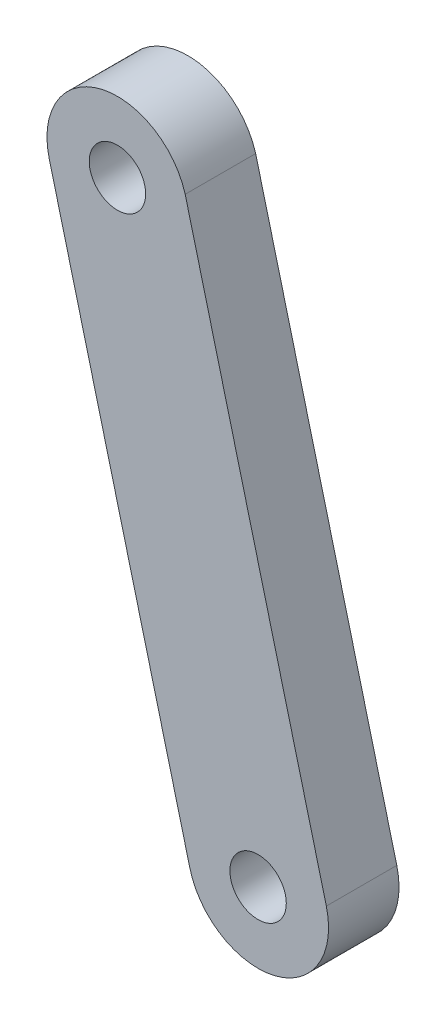
ISO-10303-21;
HEADER;
FILE_DESCRIPTION(('STEP AP214'),'2;1');
FILE_NAME('part.step','',(''),(''),'','','');
FILE_SCHEMA(('AUTOMOTIVE_DESIGN { 1 0 10303 214 1 1 1 1 }'));
ENDSEC;
DATA;
#1=APPLICATION_CONTEXT('core data for automotive mechanical design processes');
#2=APPLICATION_PROTOCOL_DEFINITION('international standard','automotive_design',2000,#1);
#3=PRODUCT_CONTEXT('',#1,'mechanical');
#4=PRODUCT('Part','Part','',(#3));
#5=PRODUCT_RELATED_PRODUCT_CATEGORY('part','',(#4));
#6=PRODUCT_DEFINITION_FORMATION('','',#4);
#7=PRODUCT_DEFINITION_CONTEXT('part definition',#1,'design');
#8=PRODUCT_DEFINITION('design','',#6,#7);
#9=PRODUCT_DEFINITION_SHAPE('','',#8);
#10=(LENGTH_UNIT() NAMED_UNIT(*) SI_UNIT(.MILLI.,.METRE.));
#11=(NAMED_UNIT(*) PLANE_ANGLE_UNIT() SI_UNIT($,.RADIAN.));
#12=(NAMED_UNIT(*) SI_UNIT($,.STERADIAN.) SOLID_ANGLE_UNIT());
#13=UNCERTAINTY_MEASURE_WITH_UNIT(LENGTH_MEASURE(1.E-05),#10,'distance_accuracy_value','');
#14=(GEOMETRIC_REPRESENTATION_CONTEXT(3) GLOBAL_UNCERTAINTY_ASSIGNED_CONTEXT((#13)) GLOBAL_UNIT_ASSIGNED_CONTEXT((#10,
#11,#12)) REPRESENTATION_CONTEXT('',''));
#15=CARTESIAN_POINT('',(0.,0.,0.));
#16=DIRECTION('',(0.,0.,1.));
#17=DIRECTION('',(1.,0.,0.));
#18=AXIS2_PLACEMENT_3D('',#15,#16,#17);
#19=CARTESIAN_POINT('',(-53.228737493068,-13.7629727954204,2.5));
#20=DIRECTION('',(0.968160490142826,0.25033031244019,0.));
#21=DIRECTION('',(-0.25033031244019,0.968160490142826,0.));
#22=AXIS2_PLACEMENT_3D('',#19,#20,#21);
#23=PLANE('',#22);
#24=DIRECTION('',(0.25033031244019,-0.968160490142826,0.));
#25=VECTOR('',#24,1.);
#26=CARTESIAN_POINT('',(-53.228737493068,-13.7629727954204,0.));
#27=LINE('',#26,#25);
#28=CARTESIAN_POINT('',(-34.5729834558803,-85.9146982359543,0.));
#29=VERTEX_POINT('',#28);
#30=CARTESIAN_POINT('',(-29.5834465668799,-105.21189174381,0.));
#31=VERTEX_POINT('',#30);
#32=EDGE_CURVE('E109',#29,#31,#27,.T.);
#33=ORIENTED_EDGE('',*,*,#32,.T.);
#34=DIRECTION('',(0.,0.,-1.));
#35=VECTOR('',#34,1.);
#36=CARTESIAN_POINT('',(-29.5834465668799,-105.21189174381,2.5));
#37=LINE('',#36,#35);
#38=CARTESIAN_POINT('',(-29.5834465668799,-105.21189174381,2.5));
#39=VERTEX_POINT('',#38);
#40=EDGE_CURVE('E11',#39,#31,#37,.T.);
#41=ORIENTED_EDGE('',*,*,#40,.F.);
#42=DIRECTION('',(0.25033031244019,-0.968160490142826,0.));
#43=VECTOR('',#42,1.);
#44=CARTESIAN_POINT('',(-53.228737493068,-13.7629727954204,2.5));
#45=LINE('',#44,#43);
#46=CARTESIAN_POINT('',(-34.5729834558803,-85.9146982359543,2.5));
#47=VERTEX_POINT('',#46);
#48=EDGE_CURVE('E88',#47,#39,#45,.T.);
#49=ORIENTED_EDGE('',*,*,#48,.F.);
#50=DIRECTION('',(0.,0.,-1.));
#51=VECTOR('',#50,1.);
#52=CARTESIAN_POINT('',(-34.5729834558803,-85.9146982359543,2.5));
#53=LINE('',#52,#51);
#54=EDGE_CURVE('E105',#47,#29,#53,.T.);
#55=ORIENTED_EDGE('',*,*,#54,.T.);
#56=EDGE_LOOP('',(#33,#41,#49,#55));
#57=FACE_BOUND('',#56,.T.);
#58=ADVANCED_FACE('F39',(#57),#23,.F.);
#59=CARTESIAN_POINT('',(-27.1632704257884,-104.586124161133,2.5));
#60=DIRECTION('',(0.,0.,-1.));
#61=DIRECTION('',(-1.,0.,0.));
#62=AXIS2_PLACEMENT_3D('',#59,#60,#61);
#63=CYLINDRICAL_SURFACE('',#62,2.49976751347752);
#64=CARTESIAN_POINT('',(-27.1632704257884,-104.586124161133,0.));
#65=DIRECTION('',(0.,0.,1.));
#66=DIRECTION('',(1.,0.,0.));
#67=AXIS2_PLACEMENT_3D('',#64,#65,#66);
#68=CIRCLE('',#67,2.49976751347752);
#69=CARTESIAN_POINT('',(-24.7430942846969,-103.960356578457,0.));
#70=VERTEX_POINT('',#69);
#71=EDGE_CURVE('E93',#31,#70,#68,.T.);
#72=ORIENTED_EDGE('',*,*,#71,.T.);
#73=DIRECTION('',(0.,0.,-1.));
#74=VECTOR('',#73,1.);
#75=CARTESIAN_POINT('',(-24.7430942846969,-103.960356578457,2.5));
#76=LINE('',#75,#74);
#77=CARTESIAN_POINT('',(-24.7430942846969,-103.960356578457,2.5));
#78=VERTEX_POINT('',#77);
#79=EDGE_CURVE('E48',#78,#70,#76,.T.);
#80=ORIENTED_EDGE('',*,*,#79,.F.);
#81=CARTESIAN_POINT('',(-27.1632704257884,-104.586124161133,2.5));
#82=DIRECTION('',(0.,0.,1.));
#83=DIRECTION('',(1.,0.,0.));
#84=AXIS2_PLACEMENT_3D('',#81,#82,#83);
#85=CIRCLE('',#84,2.49976751347752);
#86=EDGE_CURVE('E82',#39,#78,#85,.T.);
#87=ORIENTED_EDGE('',*,*,#86,.F.);
#88=ORIENTED_EDGE('',*,*,#40,.T.);
#89=EDGE_LOOP('',(#72,#80,#87,#88));
#90=FACE_BOUND('',#89,.T.);
#91=ADVANCED_FACE('F92',(#90),#63,.T.);
#92=CARTESIAN_POINT('',(-48.388385210885,-12.5114376300671,2.5));
#93=DIRECTION('',(0.968160490142826,0.25033031244019,0.));
#94=DIRECTION('',(-0.25033031244019,0.968160490142826,0.));
#95=AXIS2_PLACEMENT_3D('',#92,#93,#94);
#96=PLANE('',#95);
#97=DIRECTION('',(0.25033031244019,-0.968160490142826,0.));
#98=VECTOR('',#97,1.);
#99=CARTESIAN_POINT('',(-48.388385210885,-12.5114376300671,0.));
#100=LINE('',#99,#98);
#101=CARTESIAN_POINT('',(-29.7497005335007,-84.5971467756001,0.));
#102=VERTEX_POINT('',#101);
#103=EDGE_CURVE('E113',#102,#70,#100,.T.);
#104=ORIENTED_EDGE('',*,*,#103,.F.);
#105=DIRECTION('',(0.,0.,-1.));
#106=VECTOR('',#105,1.);
#107=CARTESIAN_POINT('',(-29.7497005335007,-84.5971467756001,2.5));
#108=LINE('',#107,#106);
#109=CARTESIAN_POINT('',(-29.7497005335007,-84.5971467756001,2.5));
#110=VERTEX_POINT('',#109);
#111=EDGE_CURVE('E72',#110,#102,#108,.T.);
#112=ORIENTED_EDGE('',*,*,#111,.F.);
#113=DIRECTION('',(0.25033031244019,-0.968160490142826,0.));
#114=VECTOR('',#113,1.);
#115=CARTESIAN_POINT('',(-48.388385210885,-12.5114376300671,2.5));
#116=LINE('',#115,#114);
#117=EDGE_CURVE('E86',#110,#78,#116,.T.);
#118=ORIENTED_EDGE('',*,*,#117,.T.);
#119=ORIENTED_EDGE('',*,*,#79,.T.);
#120=EDGE_LOOP('',(#104,#112,#118,#119));
#121=FACE_BOUND('',#120,.T.);
#122=ADVANCED_FACE('F97',(#121),#96,.T.);
#123=CARTESIAN_POINT('',(-32.1523571253241,-85.2888142510174,2.5));
#124=DIRECTION('',(0.,0.,-1.));
#125=DIRECTION('',(-1.,0.,0.));
#126=AXIS2_PLACEMENT_3D('',#123,#124,#125);
#127=CYLINDRICAL_SURFACE('',#126,2.50023250814449);
#128=CARTESIAN_POINT('',(-32.1523571253241,-85.2888142510174,0.));
#129=DIRECTION('',(0.,0.,1.));
#130=DIRECTION('',(1.,0.,0.));
#131=AXIS2_PLACEMENT_3D('',#128,#129,#130);
#132=CIRCLE('',#131,2.50023250814449);
#133=EDGE_CURVE('E75',#102,#29,#132,.T.);
#134=ORIENTED_EDGE('',*,*,#133,.T.);
#135=ORIENTED_EDGE('',*,*,#54,.F.);
#136=CARTESIAN_POINT('',(-32.1523571253241,-85.2888142510174,2.5));
#137=DIRECTION('',(0.,0.,1.));
#138=DIRECTION('',(1.,0.,0.));
#139=AXIS2_PLACEMENT_3D('',#136,#137,#138);
#140=CIRCLE('',#139,2.50023250814449);
#141=EDGE_CURVE('E56',#110,#47,#140,.T.);
#142=ORIENTED_EDGE('',*,*,#141,.F.);
#143=ORIENTED_EDGE('',*,*,#111,.T.);
#144=EDGE_LOOP('',(#134,#135,#142,#143));
#145=FACE_BOUND('',#144,.T.);
#146=ADVANCED_FACE('F141',(#145),#127,.T.);
#147=CARTESIAN_POINT('',(-27.1632704257884,-104.586124161133,2.5));
#148=DIRECTION('',(0.,0.,-1.));
#149=DIRECTION('',(-1.,0.,0.));
#150=AXIS2_PLACEMENT_3D('',#147,#148,#149);
#151=CYLINDRICAL_SURFACE('',#150,1.);
#152=CARTESIAN_POINT('',(-27.1632704257884,-104.586124161133,2.5));
#153=DIRECTION('',(0.,0.,1.));
#154=DIRECTION('',(1.,0.,0.));
#155=AXIS2_PLACEMENT_3D('',#152,#153,#154);
#156=CIRCLE('',#155,1.);
#157=CARTESIAN_POINT('',(-26.1632704257884,-104.586124161133,2.5));
#158=VERTEX_POINT('',#157);
#159=EDGE_CURVE('E119',#158,#158,#156,.T.);
#160=ORIENTED_EDGE('',*,*,#159,.T.);
#161=EDGE_LOOP('',(#160));
#162=FACE_BOUND('',#161,.T.);
#163=CARTESIAN_POINT('',(-27.1632704257884,-104.586124161133,0.));
#164=DIRECTION('',(0.,0.,1.));
#165=DIRECTION('',(1.,0.,0.));
#166=AXIS2_PLACEMENT_3D('',#163,#164,#165);
#167=CIRCLE('',#166,1.);
#168=CARTESIAN_POINT('',(-26.1632704257884,-104.586124161133,0.));
#169=VERTEX_POINT('',#168);
#170=EDGE_CURVE('E106',#169,#169,#167,.T.);
#171=ORIENTED_EDGE('',*,*,#170,.F.);
#172=EDGE_LOOP('',(#171));
#173=FACE_BOUND('',#172,.T.);
#174=ADVANCED_FACE('F41',(#162,#173),#151,.F.);
#175=CARTESIAN_POINT('',(-32.1523571253241,-85.2888142510174,2.5));
#176=DIRECTION('',(0.,0.,-1.));
#177=DIRECTION('',(-1.,0.,0.));
#178=AXIS2_PLACEMENT_3D('',#175,#176,#177);
#179=CYLINDRICAL_SURFACE('',#178,0.999999999999995);
#180=CARTESIAN_POINT('',(-32.1523571253241,-85.2888142510174,2.5));
#181=DIRECTION('',(0.,0.,1.));
#182=DIRECTION('',(1.,0.,0.));
#183=AXIS2_PLACEMENT_3D('',#180,#181,#182);
#184=CIRCLE('',#183,0.999999999999995);
#185=CARTESIAN_POINT('',(-31.1523571253241,-85.2888142510174,2.5));
#186=VERTEX_POINT('',#185);
#187=EDGE_CURVE('E99',#186,#186,#184,.T.);
#188=ORIENTED_EDGE('',*,*,#187,.T.);
#189=EDGE_LOOP('',(#188));
#190=FACE_BOUND('',#189,.T.);
#191=CARTESIAN_POINT('',(-32.1523571253241,-85.2888142510174,0.));
#192=DIRECTION('',(0.,0.,1.));
#193=DIRECTION('',(1.,0.,0.));
#194=AXIS2_PLACEMENT_3D('',#191,#192,#193);
#195=CIRCLE('',#194,0.999999999999995);
#196=CARTESIAN_POINT('',(-31.1523571253241,-85.2888142510174,0.));
#197=VERTEX_POINT('',#196);
#198=EDGE_CURVE('E116',#197,#197,#195,.T.);
#199=ORIENTED_EDGE('',*,*,#198,.F.);
#200=EDGE_LOOP('',(#199));
#201=FACE_BOUND('',#200,.T.);
#202=ADVANCED_FACE('F131',(#190,#201),#179,.F.);
#203=CARTESIAN_POINT('',(0.,0.,2.5));
#204=DIRECTION('',(0.,0.,1.));
#205=DIRECTION('',(1.,0.,0.));
#206=AXIS2_PLACEMENT_3D('',#203,#204,#205);
#207=PLANE('',#206);
#208=ORIENTED_EDGE('',*,*,#159,.F.);
#209=EDGE_LOOP('',(#208));
#210=FACE_BOUND('',#209,.T.);
#211=ORIENTED_EDGE('',*,*,#48,.T.);
#212=ORIENTED_EDGE('',*,*,#86,.T.);
#213=ORIENTED_EDGE('',*,*,#117,.F.);
#214=ORIENTED_EDGE('',*,*,#141,.T.);
#215=EDGE_LOOP('',(#211,#212,#213,#214));
#216=FACE_BOUND('',#215,.T.);
#217=ORIENTED_EDGE('',*,*,#187,.F.);
#218=EDGE_LOOP('',(#217));
#219=FACE_BOUND('',#218,.T.);
#220=ADVANCED_FACE('F83',(#210,#216,#219),#207,.T.);
#221=CARTESIAN_POINT('',(0.,0.,0.));
#222=DIRECTION('',(0.,0.,1.));
#223=DIRECTION('',(1.,0.,0.));
#224=AXIS2_PLACEMENT_3D('',#221,#222,#223);
#225=PLANE('',#224);
#226=ORIENTED_EDGE('',*,*,#170,.T.);
#227=EDGE_LOOP('',(#226));
#228=FACE_BOUND('',#227,.T.);
#229=ORIENTED_EDGE('',*,*,#32,.F.);
#230=ORIENTED_EDGE('',*,*,#133,.F.);
#231=ORIENTED_EDGE('',*,*,#103,.T.);
#232=ORIENTED_EDGE('',*,*,#71,.F.);
#233=EDGE_LOOP('',(#229,#230,#231,#232));
#234=FACE_BOUND('',#233,.T.);
#235=ORIENTED_EDGE('',*,*,#198,.T.);
#236=EDGE_LOOP('',(#235));
#237=FACE_BOUND('',#236,.T.);
#238=ADVANCED_FACE('F124',(#228,#234,#237),#225,.F.);
#239=CLOSED_SHELL('',(#58,#91,#122,#146,#174,#202,#220,#238));
#240=MANIFOLD_SOLID_BREP('B2',#239);
#241=ADVANCED_BREP_SHAPE_REPRESENTATION('',(#18,#240),#14);
#242=SHAPE_DEFINITION_REPRESENTATION(#9,#241);
ENDSEC;
END-ISO-10303-21;
